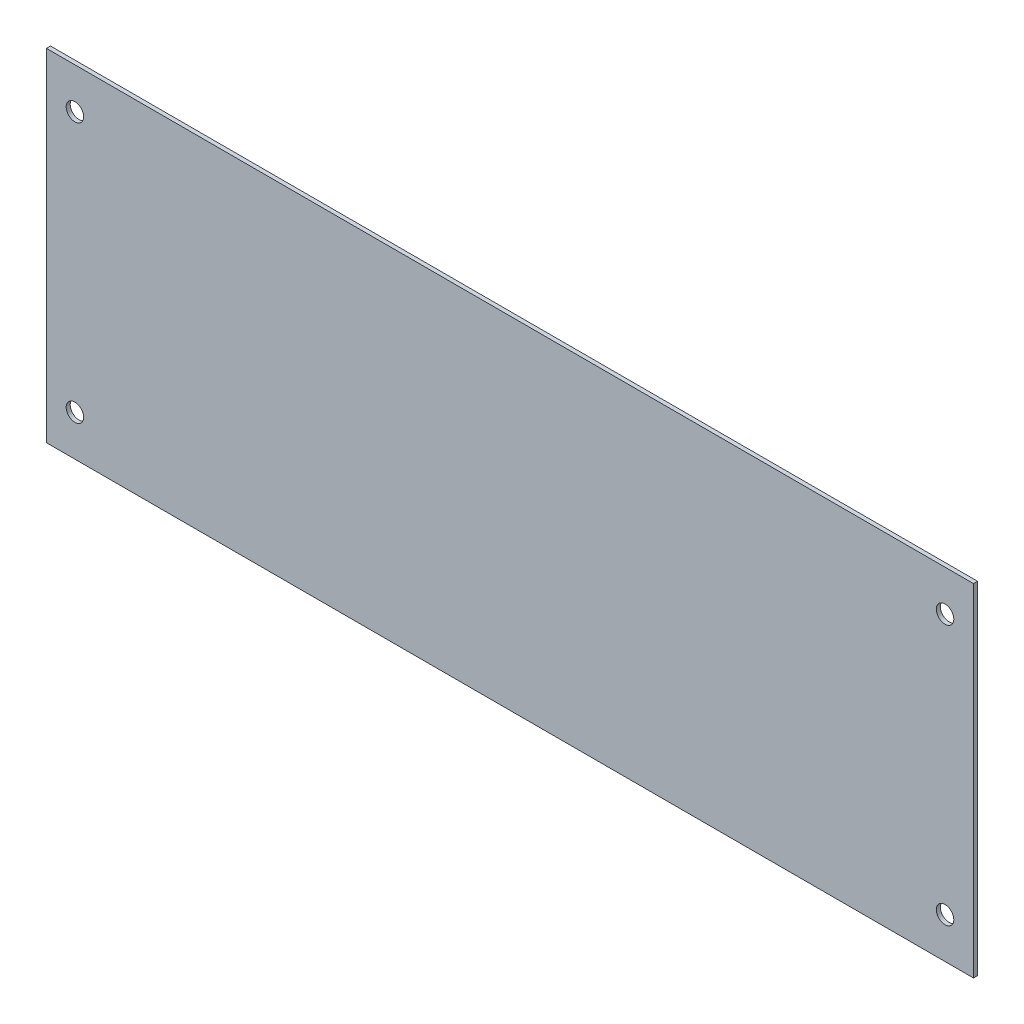
ISO-10303-21;
HEADER;
FILE_DESCRIPTION(('STEP AP214'),'2;1');
FILE_NAME('part.step','',(''),(''),'','','');
FILE_SCHEMA(('AUTOMOTIVE_DESIGN { 1 0 10303 214 1 1 1 1 }'));
ENDSEC;
DATA;
#1=APPLICATION_CONTEXT('core data for automotive mechanical design processes');
#2=APPLICATION_PROTOCOL_DEFINITION('international standard','automotive_design',2000,#1);
#3=PRODUCT_CONTEXT('',#1,'mechanical');
#4=PRODUCT('Part','Part','',(#3));
#5=PRODUCT_RELATED_PRODUCT_CATEGORY('part','',(#4));
#6=PRODUCT_DEFINITION_FORMATION('','',#4);
#7=PRODUCT_DEFINITION_CONTEXT('part definition',#1,'design');
#8=PRODUCT_DEFINITION('design','',#6,#7);
#9=PRODUCT_DEFINITION_SHAPE('','',#8);
#10=(LENGTH_UNIT() NAMED_UNIT(*) SI_UNIT(.MILLI.,.METRE.));
#11=(NAMED_UNIT(*) PLANE_ANGLE_UNIT() SI_UNIT($,.RADIAN.));
#12=(NAMED_UNIT(*) SI_UNIT($,.STERADIAN.) SOLID_ANGLE_UNIT());
#13=UNCERTAINTY_MEASURE_WITH_UNIT(LENGTH_MEASURE(1.E-05),#10,'distance_accuracy_value','');
#14=(GEOMETRIC_REPRESENTATION_CONTEXT(3) GLOBAL_UNCERTAINTY_ASSIGNED_CONTEXT((#13)) GLOBAL_UNIT_ASSIGNED_CONTEXT((#10,
#11,#12)) REPRESENTATION_CONTEXT('',''));
#15=CARTESIAN_POINT('',(0.,0.,0.));
#16=DIRECTION('',(0.,0.,1.));
#17=DIRECTION('',(1.,0.,0.));
#18=AXIS2_PLACEMENT_3D('',#15,#16,#17);
#19=CARTESIAN_POINT('',(-114.,-42.,1.));
#20=DIRECTION('',(0.,0.,-1.));
#21=DIRECTION('',(-1.,0.,0.));
#22=AXIS2_PLACEMENT_3D('',#19,#20,#21);
#23=PLANE('',#22);
#24=CARTESIAN_POINT('',(-107.,-32.,1.));
#25=DIRECTION('',(0.,0.,1.));
#26=DIRECTION('',(1.,0.,0.));
#27=AXIS2_PLACEMENT_3D('',#24,#25,#26);
#28=CIRCLE('',#27,2.15);
#29=CARTESIAN_POINT('',(-104.85,-32.,1.));
#30=VERTEX_POINT('',#29);
#31=EDGE_CURVE('E118',#30,#30,#28,.T.);
#32=ORIENTED_EDGE('',*,*,#31,.F.);
#33=EDGE_LOOP('',(#32));
#34=FACE_BOUND('',#33,.T.);
#35=CARTESIAN_POINT('',(107.,32.,1.));
#36=DIRECTION('',(0.,0.,1.));
#37=DIRECTION('',(1.,0.,0.));
#38=AXIS2_PLACEMENT_3D('',#35,#36,#37);
#39=CIRCLE('',#38,2.15);
#40=CARTESIAN_POINT('',(109.15,32.,1.));
#41=VERTEX_POINT('',#40);
#42=EDGE_CURVE('E97',#41,#41,#39,.T.);
#43=ORIENTED_EDGE('',*,*,#42,.F.);
#44=EDGE_LOOP('',(#43));
#45=FACE_BOUND('',#44,.T.);
#46=DIRECTION('',(0.,-1.,0.));
#47=VECTOR('',#46,1.);
#48=CARTESIAN_POINT('',(-114.,-42.,1.));
#49=LINE('',#48,#47);
#50=CARTESIAN_POINT('',(-114.,42.,1.));
#51=VERTEX_POINT('',#50);
#52=CARTESIAN_POINT('',(-114.,-42.,1.));
#53=VERTEX_POINT('',#52);
#54=EDGE_CURVE('E82',#51,#53,#49,.T.);
#55=ORIENTED_EDGE('',*,*,#54,.T.);
#56=DIRECTION('',(1.,0.,0.));
#57=VECTOR('',#56,1.);
#58=CARTESIAN_POINT('',(-114.,-42.,1.));
#59=LINE('',#58,#57);
#60=CARTESIAN_POINT('',(114.,-42.,1.));
#61=VERTEX_POINT('',#60);
#62=EDGE_CURVE('E77',#53,#61,#59,.T.);
#63=ORIENTED_EDGE('',*,*,#62,.T.);
#64=DIRECTION('',(0.,1.,0.));
#65=VECTOR('',#64,1.);
#66=CARTESIAN_POINT('',(114.,-42.,1.));
#67=LINE('',#66,#65);
#68=CARTESIAN_POINT('',(114.,42.,1.));
#69=VERTEX_POINT('',#68);
#70=EDGE_CURVE('E80',#61,#69,#67,.T.);
#71=ORIENTED_EDGE('',*,*,#70,.T.);
#72=DIRECTION('',(-1.,0.,0.));
#73=VECTOR('',#72,1.);
#74=CARTESIAN_POINT('',(-114.,42.,1.));
#75=LINE('',#74,#73);
#76=EDGE_CURVE('E47',#69,#51,#75,.T.);
#77=ORIENTED_EDGE('',*,*,#76,.T.);
#78=EDGE_LOOP('',(#55,#63,#71,#77));
#79=FACE_BOUND('',#78,.T.);
#80=CARTESIAN_POINT('',(-107.,32.,1.));
#81=DIRECTION('',(0.,0.,1.));
#82=DIRECTION('',(-1.,0.,0.));
#83=AXIS2_PLACEMENT_3D('',#80,#81,#82);
#84=CIRCLE('',#83,2.15);
#85=CARTESIAN_POINT('',(-109.15,32.,1.));
#86=VERTEX_POINT('',#85);
#87=EDGE_CURVE('E112',#86,#86,#84,.T.);
#88=ORIENTED_EDGE('',*,*,#87,.F.);
#89=EDGE_LOOP('',(#88));
#90=FACE_BOUND('',#89,.T.);
#91=CARTESIAN_POINT('',(107.,-32.,1.));
#92=DIRECTION('',(0.,0.,1.));
#93=DIRECTION('',(-1.,0.,0.));
#94=AXIS2_PLACEMENT_3D('',#91,#92,#93);
#95=CIRCLE('',#94,2.15);
#96=CARTESIAN_POINT('',(104.85,-32.,1.));
#97=VERTEX_POINT('',#96);
#98=EDGE_CURVE('E124',#97,#97,#95,.T.);
#99=ORIENTED_EDGE('',*,*,#98,.F.);
#100=EDGE_LOOP('',(#99));
#101=FACE_BOUND('',#100,.T.);
#102=ADVANCED_FACE('F30',(#34,#45,#79,#90,#101),#23,.F.);
#103=CARTESIAN_POINT('',(-114.,-42.,0.));
#104=DIRECTION('',(0.,0.,-1.));
#105=DIRECTION('',(-1.,0.,0.));
#106=AXIS2_PLACEMENT_3D('',#103,#104,#105);
#107=PLANE('',#106);
#108=CARTESIAN_POINT('',(-107.,-32.,0.));
#109=DIRECTION('',(0.,0.,1.));
#110=DIRECTION('',(1.,0.,0.));
#111=AXIS2_PLACEMENT_3D('',#108,#109,#110);
#112=CIRCLE('',#111,2.15);
#113=CARTESIAN_POINT('',(-104.85,-32.,0.));
#114=VERTEX_POINT('',#113);
#115=EDGE_CURVE('E121',#114,#114,#112,.T.);
#116=ORIENTED_EDGE('',*,*,#115,.T.);
#117=EDGE_LOOP('',(#116));
#118=FACE_BOUND('',#117,.T.);
#119=CARTESIAN_POINT('',(107.,32.,0.));
#120=DIRECTION('',(0.,0.,1.));
#121=DIRECTION('',(1.,0.,0.));
#122=AXIS2_PLACEMENT_3D('',#119,#120,#121);
#123=CIRCLE('',#122,2.15);
#124=CARTESIAN_POINT('',(109.15,32.,0.));
#125=VERTEX_POINT('',#124);
#126=EDGE_CURVE('E109',#125,#125,#123,.T.);
#127=ORIENTED_EDGE('',*,*,#126,.T.);
#128=EDGE_LOOP('',(#127));
#129=FACE_BOUND('',#128,.T.);
#130=DIRECTION('',(0.,-1.,0.));
#131=VECTOR('',#130,1.);
#132=CARTESIAN_POINT('',(-114.,-42.,0.));
#133=LINE('',#132,#131);
#134=CARTESIAN_POINT('',(-114.,42.,0.));
#135=VERTEX_POINT('',#134);
#136=CARTESIAN_POINT('',(-114.,-42.,0.));
#137=VERTEX_POINT('',#136);
#138=EDGE_CURVE('E94',#135,#137,#133,.T.);
#139=ORIENTED_EDGE('',*,*,#138,.F.);
#140=DIRECTION('',(-1.,0.,0.));
#141=VECTOR('',#140,1.);
#142=CARTESIAN_POINT('',(-114.,42.,0.));
#143=LINE('',#142,#141);
#144=CARTESIAN_POINT('',(114.,42.,0.));
#145=VERTEX_POINT('',#144);
#146=EDGE_CURVE('E70',#145,#135,#143,.T.);
#147=ORIENTED_EDGE('',*,*,#146,.F.);
#148=DIRECTION('',(0.,1.,0.));
#149=VECTOR('',#148,1.);
#150=CARTESIAN_POINT('',(114.,-42.,0.));
#151=LINE('',#150,#149);
#152=CARTESIAN_POINT('',(114.,-42.,0.));
#153=VERTEX_POINT('',#152);
#154=EDGE_CURVE('E64',#153,#145,#151,.T.);
#155=ORIENTED_EDGE('',*,*,#154,.F.);
#156=DIRECTION('',(1.,0.,0.));
#157=VECTOR('',#156,1.);
#158=CARTESIAN_POINT('',(-114.,-42.,0.));
#159=LINE('',#158,#157);
#160=EDGE_CURVE('E86',#137,#153,#159,.T.);
#161=ORIENTED_EDGE('',*,*,#160,.F.);
#162=EDGE_LOOP('',(#139,#147,#155,#161));
#163=FACE_BOUND('',#162,.T.);
#164=CARTESIAN_POINT('',(-107.,32.,0.));
#165=DIRECTION('',(0.,0.,1.));
#166=DIRECTION('',(-1.,0.,0.));
#167=AXIS2_PLACEMENT_3D('',#164,#165,#166);
#168=CIRCLE('',#167,2.15);
#169=CARTESIAN_POINT('',(-109.15,32.,0.));
#170=VERTEX_POINT('',#169);
#171=EDGE_CURVE('E115',#170,#170,#168,.T.);
#172=ORIENTED_EDGE('',*,*,#171,.T.);
#173=EDGE_LOOP('',(#172));
#174=FACE_BOUND('',#173,.T.);
#175=CARTESIAN_POINT('',(107.,-32.,0.));
#176=DIRECTION('',(0.,0.,1.));
#177=DIRECTION('',(-1.,0.,0.));
#178=AXIS2_PLACEMENT_3D('',#175,#176,#177);
#179=CIRCLE('',#178,2.15);
#180=CARTESIAN_POINT('',(104.85,-32.,0.));
#181=VERTEX_POINT('',#180);
#182=EDGE_CURVE('E127',#181,#181,#179,.T.);
#183=ORIENTED_EDGE('',*,*,#182,.T.);
#184=EDGE_LOOP('',(#183));
#185=FACE_BOUND('',#184,.T.);
#186=ADVANCED_FACE('F105',(#118,#129,#163,#174,#185),#107,.T.);
#187=CARTESIAN_POINT('',(-114.,-42.,1.));
#188=DIRECTION('',(1.,0.,0.));
#189=DIRECTION('',(0.,0.,-1.));
#190=AXIS2_PLACEMENT_3D('',#187,#188,#189);
#191=PLANE('',#190);
#192=ORIENTED_EDGE('',*,*,#138,.T.);
#193=DIRECTION('',(0.,0.,-1.));
#194=VECTOR('',#193,1.);
#195=CARTESIAN_POINT('',(-114.,-42.,1.));
#196=LINE('',#195,#194);
#197=EDGE_CURVE('E11',#53,#137,#196,.T.);
#198=ORIENTED_EDGE('',*,*,#197,.F.);
#199=ORIENTED_EDGE('',*,*,#54,.F.);
#200=DIRECTION('',(0.,0.,-1.));
#201=VECTOR('',#200,1.);
#202=CARTESIAN_POINT('',(-114.,42.,1.));
#203=LINE('',#202,#201);
#204=EDGE_CURVE('E90',#51,#135,#203,.T.);
#205=ORIENTED_EDGE('',*,*,#204,.T.);
#206=EDGE_LOOP('',(#192,#198,#199,#205));
#207=FACE_BOUND('',#206,.T.);
#208=ADVANCED_FACE('F32',(#207),#191,.F.);
#209=CARTESIAN_POINT('',(-114.,-42.,1.));
#210=DIRECTION('',(0.,1.,0.));
#211=DIRECTION('',(0.,0.,1.));
#212=AXIS2_PLACEMENT_3D('',#209,#210,#211);
#213=PLANE('',#212);
#214=ORIENTED_EDGE('',*,*,#160,.T.);
#215=DIRECTION('',(0.,0.,-1.));
#216=VECTOR('',#215,1.);
#217=CARTESIAN_POINT('',(114.,-42.,1.));
#218=LINE('',#217,#216);
#219=EDGE_CURVE('E39',#61,#153,#218,.T.);
#220=ORIENTED_EDGE('',*,*,#219,.F.);
#221=ORIENTED_EDGE('',*,*,#62,.F.);
#222=ORIENTED_EDGE('',*,*,#197,.T.);
#223=EDGE_LOOP('',(#214,#220,#221,#222));
#224=FACE_BOUND('',#223,.T.);
#225=ADVANCED_FACE('F85',(#224),#213,.F.);
#226=CARTESIAN_POINT('',(114.,-42.,1.));
#227=DIRECTION('',(-1.,0.,0.));
#228=DIRECTION('',(0.,0.,1.));
#229=AXIS2_PLACEMENT_3D('',#226,#227,#228);
#230=PLANE('',#229);
#231=ORIENTED_EDGE('',*,*,#154,.T.);
#232=DIRECTION('',(0.,0.,-1.));
#233=VECTOR('',#232,1.);
#234=CARTESIAN_POINT('',(114.,42.,1.));
#235=LINE('',#234,#233);
#236=EDGE_CURVE('E87',#69,#145,#235,.T.);
#237=ORIENTED_EDGE('',*,*,#236,.F.);
#238=ORIENTED_EDGE('',*,*,#70,.F.);
#239=ORIENTED_EDGE('',*,*,#219,.T.);
#240=EDGE_LOOP('',(#231,#237,#238,#239));
#241=FACE_BOUND('',#240,.T.);
#242=ADVANCED_FACE('F88',(#241),#230,.F.);
#243=CARTESIAN_POINT('',(-114.,42.,1.));
#244=DIRECTION('',(0.,-1.,0.));
#245=DIRECTION('',(1.,0.,0.));
#246=AXIS2_PLACEMENT_3D('',#243,#244,#245);
#247=PLANE('',#246);
#248=ORIENTED_EDGE('',*,*,#146,.T.);
#249=ORIENTED_EDGE('',*,*,#204,.F.);
#250=ORIENTED_EDGE('',*,*,#76,.F.);
#251=ORIENTED_EDGE('',*,*,#236,.T.);
#252=EDGE_LOOP('',(#248,#249,#250,#251));
#253=FACE_BOUND('',#252,.T.);
#254=ADVANCED_FACE('F102',(#253),#247,.F.);
#255=CARTESIAN_POINT('',(107.,32.,1.));
#256=DIRECTION('',(0.,0.,-1.));
#257=DIRECTION('',(-1.,0.,0.));
#258=AXIS2_PLACEMENT_3D('',#255,#256,#257);
#259=CYLINDRICAL_SURFACE('',#258,2.15);
#260=ORIENTED_EDGE('',*,*,#42,.T.);
#261=EDGE_LOOP('',(#260));
#262=FACE_BOUND('',#261,.T.);
#263=ORIENTED_EDGE('',*,*,#126,.F.);
#264=EDGE_LOOP('',(#263));
#265=FACE_BOUND('',#264,.T.);
#266=ADVANCED_FACE('F147',(#262,#265),#259,.F.);
#267=CARTESIAN_POINT('',(-107.,32.,1.));
#268=DIRECTION('',(0.,0.,-1.));
#269=DIRECTION('',(-1.,0.,0.));
#270=AXIS2_PLACEMENT_3D('',#267,#268,#269);
#271=CYLINDRICAL_SURFACE('',#270,2.15);
#272=ORIENTED_EDGE('',*,*,#87,.T.);
#273=EDGE_LOOP('',(#272));
#274=FACE_BOUND('',#273,.T.);
#275=ORIENTED_EDGE('',*,*,#171,.F.);
#276=EDGE_LOOP('',(#275));
#277=FACE_BOUND('',#276,.T.);
#278=ADVANCED_FACE('F193',(#274,#277),#271,.F.);
#279=CARTESIAN_POINT('',(-107.,-32.,1.));
#280=DIRECTION('',(0.,0.,-1.));
#281=DIRECTION('',(-1.,0.,0.));
#282=AXIS2_PLACEMENT_3D('',#279,#280,#281);
#283=CYLINDRICAL_SURFACE('',#282,2.15);
#284=ORIENTED_EDGE('',*,*,#31,.T.);
#285=EDGE_LOOP('',(#284));
#286=FACE_BOUND('',#285,.T.);
#287=ORIENTED_EDGE('',*,*,#115,.F.);
#288=EDGE_LOOP('',(#287));
#289=FACE_BOUND('',#288,.T.);
#290=ADVANCED_FACE('F201',(#286,#289),#283,.F.);
#291=CARTESIAN_POINT('',(107.,-32.,1.));
#292=DIRECTION('',(0.,0.,-1.));
#293=DIRECTION('',(-1.,0.,0.));
#294=AXIS2_PLACEMENT_3D('',#291,#292,#293);
#295=CYLINDRICAL_SURFACE('',#294,2.15);
#296=ORIENTED_EDGE('',*,*,#98,.T.);
#297=EDGE_LOOP('',(#296));
#298=FACE_BOUND('',#297,.T.);
#299=ORIENTED_EDGE('',*,*,#182,.F.);
#300=EDGE_LOOP('',(#299));
#301=FACE_BOUND('',#300,.T.);
#302=ADVANCED_FACE('F133',(#298,#301),#295,.F.);
#303=CLOSED_SHELL('',(#102,#186,#208,#225,#242,#254,#266,#278,#290,#302));
#304=MANIFOLD_SOLID_BREP('B2',#303);
#305=ADVANCED_BREP_SHAPE_REPRESENTATION('',(#18,#304),#14);
#306=SHAPE_DEFINITION_REPRESENTATION(#9,#305);
ENDSEC;
END-ISO-10303-21;
